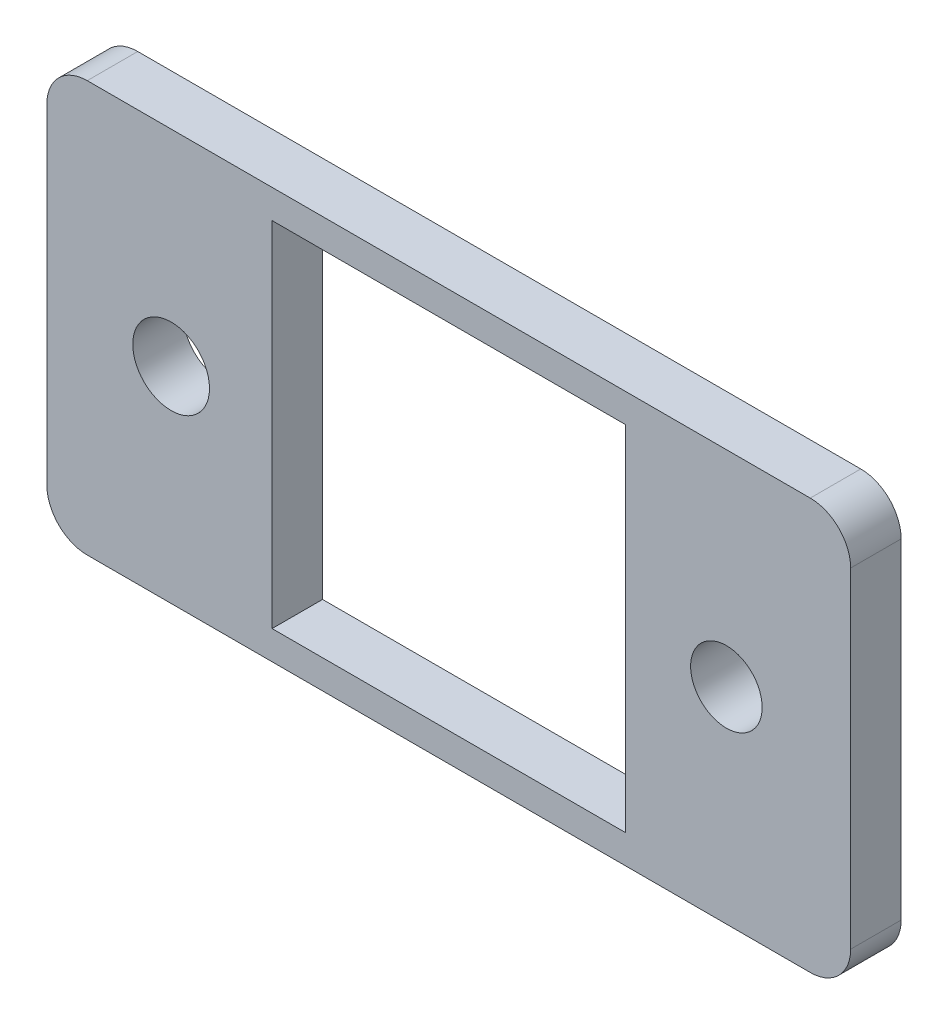
ISO-10303-21;
HEADER;
FILE_DESCRIPTION(('STEP AP214'),'2;1');
FILE_NAME('part.step','',(''),(''),'','','');
FILE_SCHEMA(('AUTOMOTIVE_DESIGN { 1 0 10303 214 1 1 1 1 }'));
ENDSEC;
DATA;
#1=APPLICATION_CONTEXT('core data for automotive mechanical design processes');
#2=APPLICATION_PROTOCOL_DEFINITION('international standard','automotive_design',2000,#1);
#3=PRODUCT_CONTEXT('',#1,'mechanical');
#4=PRODUCT('Part','Part','',(#3));
#5=PRODUCT_RELATED_PRODUCT_CATEGORY('part','',(#4));
#6=PRODUCT_DEFINITION_FORMATION('','',#4);
#7=PRODUCT_DEFINITION_CONTEXT('part definition',#1,'design');
#8=PRODUCT_DEFINITION('design','',#6,#7);
#9=PRODUCT_DEFINITION_SHAPE('','',#8);
#10=(LENGTH_UNIT() NAMED_UNIT(*) SI_UNIT(.MILLI.,.METRE.));
#11=(NAMED_UNIT(*) PLANE_ANGLE_UNIT() SI_UNIT($,.RADIAN.));
#12=(NAMED_UNIT(*) SI_UNIT($,.STERADIAN.) SOLID_ANGLE_UNIT());
#13=UNCERTAINTY_MEASURE_WITH_UNIT(LENGTH_MEASURE(1.E-05),#10,'distance_accuracy_value','');
#14=(GEOMETRIC_REPRESENTATION_CONTEXT(3) GLOBAL_UNCERTAINTY_ASSIGNED_CONTEXT((#13)) GLOBAL_UNIT_ASSIGNED_CONTEXT((#10,
#11,#12)) REPRESENTATION_CONTEXT('',''));
#15=CARTESIAN_POINT('',(0.,0.,0.));
#16=DIRECTION('',(0.,0.,1.));
#17=DIRECTION('',(1.,0.,0.));
#18=AXIS2_PLACEMENT_3D('',#15,#16,#17);
#19=CARTESIAN_POINT('',(0.,-12.9212908327685,3.175));
#20=DIRECTION('',(0.,1.,0.));
#21=DIRECTION('',(0.,0.,1.));
#22=AXIS2_PLACEMENT_3D('',#19,#20,#21);
#23=PLANE('',#22);
#24=DIRECTION('',(1.,0.,0.));
#25=VECTOR('',#24,1.);
#26=CARTESIAN_POINT('',(0.,-12.9212908327685,3.175));
#27=LINE('',#26,#25);
#28=CARTESIAN_POINT('',(-22.7378558296886,-12.9212908327685,3.175));
#29=VERTEX_POINT('',#28);
#30=CARTESIAN_POINT('',(22.737855829657,-12.9212908327685,3.175));
#31=VERTEX_POINT('',#30);
#32=EDGE_CURVE('E153',#29,#31,#27,.T.);
#33=ORIENTED_EDGE('',*,*,#32,.F.);
#34=DIRECTION('',(0.,0.,-1.));
#35=VECTOR('',#34,1.);
#36=CARTESIAN_POINT('',(-22.7378558296886,-12.9212908327685,0.));
#37=LINE('',#36,#35);
#38=CARTESIAN_POINT('',(-22.7378558296886,-12.9212908327685,0.));
#39=VERTEX_POINT('',#38);
#40=EDGE_CURVE('E198',#29,#39,#37,.T.);
#41=ORIENTED_EDGE('',*,*,#40,.T.);
#42=DIRECTION('',(1.,0.,0.));
#43=VECTOR('',#42,1.);
#44=CARTESIAN_POINT('',(0.,-12.9212908327685,0.));
#45=LINE('',#44,#43);
#46=CARTESIAN_POINT('',(22.737855829657,-12.9212908327685,0.));
#47=VERTEX_POINT('',#46);
#48=EDGE_CURVE('E179',#39,#47,#45,.T.);
#49=ORIENTED_EDGE('',*,*,#48,.T.);
#50=DIRECTION('',(0.,0.,-1.));
#51=VECTOR('',#50,1.);
#52=CARTESIAN_POINT('',(22.737855829657,-12.9212908327685,3.175));
#53=LINE('',#52,#51);
#54=EDGE_CURVE('E133',#47,#31,#53,.F.);
#55=ORIENTED_EDGE('',*,*,#54,.T.);
#56=EDGE_LOOP('',(#33,#41,#49,#55));
#57=FACE_BOUND('',#56,.T.);
#58=ADVANCED_FACE('F33',(#57),#23,.F.);
#59=CARTESIAN_POINT('',(25.277855829657,0.,3.175));
#60=DIRECTION('',(-1.,0.,0.));
#61=DIRECTION('',(0.,0.,1.));
#62=AXIS2_PLACEMENT_3D('',#59,#60,#61);
#63=PLANE('',#62);
#64=DIRECTION('',(0.,1.,0.));
#65=VECTOR('',#64,1.);
#66=CARTESIAN_POINT('',(25.277855829657,0.,3.175));
#67=LINE('',#66,#65);
#68=CARTESIAN_POINT('',(25.277855829657,-10.3812908327685,3.175));
#69=VERTEX_POINT('',#68);
#70=CARTESIAN_POINT('',(25.277855829657,10.3812908327721,3.175));
#71=VERTEX_POINT('',#70);
#72=EDGE_CURVE('E156',#69,#71,#67,.T.);
#73=ORIENTED_EDGE('',*,*,#72,.F.);
#74=DIRECTION('',(0.,0.,-1.));
#75=VECTOR('',#74,1.);
#76=CARTESIAN_POINT('',(25.277855829657,-10.3812908327685,3.175));
#77=LINE('',#76,#75);
#78=CARTESIAN_POINT('',(25.277855829657,-10.3812908327685,0.));
#79=VERTEX_POINT('',#78);
#80=EDGE_CURVE('E223',#69,#79,#77,.T.);
#81=ORIENTED_EDGE('',*,*,#80,.T.);
#82=DIRECTION('',(0.,1.,0.));
#83=VECTOR('',#82,1.);
#84=CARTESIAN_POINT('',(25.277855829657,0.,0.));
#85=LINE('',#84,#83);
#86=CARTESIAN_POINT('',(25.277855829657,10.3812908327721,0.));
#87=VERTEX_POINT('',#86);
#88=EDGE_CURVE('E182',#79,#87,#85,.T.);
#89=ORIENTED_EDGE('',*,*,#88,.T.);
#90=DIRECTION('',(0.,0.,-1.));
#91=VECTOR('',#90,1.);
#92=CARTESIAN_POINT('',(25.277855829657,10.3812908327721,3.175));
#93=LINE('',#92,#91);
#94=EDGE_CURVE('E221',#87,#71,#93,.F.);
#95=ORIENTED_EDGE('',*,*,#94,.T.);
#96=EDGE_LOOP('',(#73,#81,#89,#95));
#97=FACE_BOUND('',#96,.T.);
#98=ADVANCED_FACE('F229',(#97),#63,.F.);
#99=CARTESIAN_POINT('',(0.,12.9212908327721,3.175));
#100=DIRECTION('',(0.,1.,0.));
#101=DIRECTION('',(0.,0.,1.));
#102=AXIS2_PLACEMENT_3D('',#99,#100,#101);
#103=PLANE('',#102);
#104=DIRECTION('',(1.,0.,0.));
#105=VECTOR('',#104,1.);
#106=CARTESIAN_POINT('',(0.,12.9212908327721,3.175));
#107=LINE('',#106,#105);
#108=CARTESIAN_POINT('',(-22.7378558296886,12.9212908327721,3.175));
#109=VERTEX_POINT('',#108);
#110=CARTESIAN_POINT('',(22.737855829657,12.9212908327721,3.175));
#111=VERTEX_POINT('',#110);
#112=EDGE_CURVE('E158',#109,#111,#107,.T.);
#113=ORIENTED_EDGE('',*,*,#112,.T.);
#114=DIRECTION('',(0.,0.,-1.));
#115=VECTOR('',#114,1.);
#116=CARTESIAN_POINT('',(22.737855829657,12.9212908327721,0.));
#117=LINE('',#116,#115);
#118=CARTESIAN_POINT('',(22.737855829657,12.9212908327721,0.));
#119=VERTEX_POINT('',#118);
#120=EDGE_CURVE('E11',#111,#119,#117,.T.);
#121=ORIENTED_EDGE('',*,*,#120,.T.);
#122=DIRECTION('',(1.,0.,0.));
#123=VECTOR('',#122,1.);
#124=CARTESIAN_POINT('',(0.,12.9212908327721,0.));
#125=LINE('',#124,#123);
#126=CARTESIAN_POINT('',(-22.7378558296886,12.9212908327721,0.));
#127=VERTEX_POINT('',#126);
#128=EDGE_CURVE('E185',#127,#119,#125,.T.);
#129=ORIENTED_EDGE('',*,*,#128,.F.);
#130=DIRECTION('',(0.,0.,-1.));
#131=VECTOR('',#130,1.);
#132=CARTESIAN_POINT('',(-22.7378558296886,12.9212908327721,3.175));
#133=LINE('',#132,#131);
#134=EDGE_CURVE('E41',#127,#109,#133,.F.);
#135=ORIENTED_EDGE('',*,*,#134,.T.);
#136=EDGE_LOOP('',(#113,#121,#129,#135));
#137=FACE_BOUND('',#136,.T.);
#138=ADVANCED_FACE('F239',(#137),#103,.T.);
#139=CARTESIAN_POINT('',(11.1124999999842,0.,3.175));
#140=DIRECTION('',(-1.,0.,0.));
#141=DIRECTION('',(0.,0.,1.));
#142=AXIS2_PLACEMENT_3D('',#139,#140,#141);
#143=PLANE('',#142);
#144=DIRECTION('',(0.,1.,0.));
#145=VECTOR('',#144,1.);
#146=CARTESIAN_POINT('',(11.1124999999842,0.,0.));
#147=LINE('',#146,#145);
#148=CARTESIAN_POINT('',(11.1124999999842,-11.1124999999982,0.));
#149=VERTEX_POINT('',#148);
#150=CARTESIAN_POINT('',(11.1124999999842,11.1125000000018,0.));
#151=VERTEX_POINT('',#150);
#152=EDGE_CURVE('E128',#149,#151,#147,.T.);
#153=ORIENTED_EDGE('',*,*,#152,.F.);
#154=DIRECTION('',(0.,0.,-1.));
#155=VECTOR('',#154,1.);
#156=CARTESIAN_POINT('',(11.1124999999842,-11.1124999999982,3.175));
#157=LINE('',#156,#155);
#158=CARTESIAN_POINT('',(11.1124999999842,-11.1124999999982,3.175));
#159=VERTEX_POINT('',#158);
#160=EDGE_CURVE('E123',#159,#149,#157,.T.);
#161=ORIENTED_EDGE('',*,*,#160,.F.);
#162=DIRECTION('',(0.,1.,0.));
#163=VECTOR('',#162,1.);
#164=CARTESIAN_POINT('',(11.1124999999842,0.,3.175));
#165=LINE('',#164,#163);
#166=CARTESIAN_POINT('',(11.1124999999842,11.1125000000018,3.175));
#167=VERTEX_POINT('',#166);
#168=EDGE_CURVE('E126',#159,#167,#165,.T.);
#169=ORIENTED_EDGE('',*,*,#168,.T.);
#170=DIRECTION('',(0.,0.,-1.));
#171=VECTOR('',#170,1.);
#172=CARTESIAN_POINT('',(11.1124999999842,11.1125000000018,3.175));
#173=LINE('',#172,#171);
#174=EDGE_CURVE('E163',#167,#151,#173,.T.);
#175=ORIENTED_EDGE('',*,*,#174,.T.);
#176=EDGE_LOOP('',(#153,#161,#169,#175));
#177=FACE_BOUND('',#176,.T.);
#178=ADVANCED_FACE('F125',(#177),#143,.T.);
#179=CARTESIAN_POINT('',(0.,-11.1124999999982,3.175));
#180=DIRECTION('',(0.,1.,0.));
#181=DIRECTION('',(-1.,0.,0.));
#182=AXIS2_PLACEMENT_3D('',#179,#180,#181);
#183=PLANE('',#182);
#184=DIRECTION('',(1.,0.,0.));
#185=VECTOR('',#184,1.);
#186=CARTESIAN_POINT('',(0.,-11.1124999999982,0.));
#187=LINE('',#186,#185);
#188=CARTESIAN_POINT('',(-11.1125000000158,-11.1124999999982,0.));
#189=VERTEX_POINT('',#188);
#190=EDGE_CURVE('E171',#189,#149,#187,.T.);
#191=ORIENTED_EDGE('',*,*,#190,.F.);
#192=DIRECTION('',(0.,0.,-1.));
#193=VECTOR('',#192,1.);
#194=CARTESIAN_POINT('',(-11.1125000000158,-11.1124999999982,3.175));
#195=LINE('',#194,#193);
#196=CARTESIAN_POINT('',(-11.1125000000158,-11.1124999999982,3.175));
#197=VERTEX_POINT('',#196);
#198=EDGE_CURVE('E134',#197,#189,#195,.T.);
#199=ORIENTED_EDGE('',*,*,#198,.F.);
#200=DIRECTION('',(1.,0.,0.));
#201=VECTOR('',#200,1.);
#202=CARTESIAN_POINT('',(0.,-11.1124999999982,3.175));
#203=LINE('',#202,#201);
#204=EDGE_CURVE('E140',#197,#159,#203,.T.);
#205=ORIENTED_EDGE('',*,*,#204,.T.);
#206=ORIENTED_EDGE('',*,*,#160,.T.);
#207=EDGE_LOOP('',(#191,#199,#205,#206));
#208=FACE_BOUND('',#207,.T.);
#209=ADVANCED_FACE('F145',(#208),#183,.T.);
#210=CARTESIAN_POINT('',(-11.1125000000158,0.,3.175));
#211=DIRECTION('',(-1.,0.,0.));
#212=DIRECTION('',(0.,0.,1.));
#213=AXIS2_PLACEMENT_3D('',#210,#211,#212);
#214=PLANE('',#213);
#215=DIRECTION('',(0.,1.,0.));
#216=VECTOR('',#215,1.);
#217=CARTESIAN_POINT('',(-11.1125000000158,0.,0.));
#218=LINE('',#217,#216);
#219=CARTESIAN_POINT('',(-11.1125000000158,11.1125000000018,0.));
#220=VERTEX_POINT('',#219);
#221=EDGE_CURVE('E173',#189,#220,#218,.T.);
#222=ORIENTED_EDGE('',*,*,#221,.T.);
#223=DIRECTION('',(0.,0.,-1.));
#224=VECTOR('',#223,1.);
#225=CARTESIAN_POINT('',(-11.1125000000158,11.1125000000018,3.175));
#226=LINE('',#225,#224);
#227=CARTESIAN_POINT('',(-11.1125000000158,11.1125000000018,3.175));
#228=VERTEX_POINT('',#227);
#229=EDGE_CURVE('E193',#228,#220,#226,.T.);
#230=ORIENTED_EDGE('',*,*,#229,.F.);
#231=DIRECTION('',(0.,1.,0.));
#232=VECTOR('',#231,1.);
#233=CARTESIAN_POINT('',(-11.1125000000158,0.,3.175));
#234=LINE('',#233,#232);
#235=EDGE_CURVE('E147',#197,#228,#234,.T.);
#236=ORIENTED_EDGE('',*,*,#235,.F.);
#237=ORIENTED_EDGE('',*,*,#198,.T.);
#238=EDGE_LOOP('',(#222,#230,#236,#237));
#239=FACE_BOUND('',#238,.T.);
#240=ADVANCED_FACE('F275',(#239),#214,.F.);
#241=CARTESIAN_POINT('',(0.,11.1125000000018,3.175));
#242=DIRECTION('',(0.,1.,0.));
#243=DIRECTION('',(-1.,0.,0.));
#244=AXIS2_PLACEMENT_3D('',#241,#242,#243);
#245=PLANE('',#244);
#246=DIRECTION('',(1.,0.,0.));
#247=VECTOR('',#246,1.);
#248=CARTESIAN_POINT('',(0.,11.1125000000018,0.));
#249=LINE('',#248,#247);
#250=EDGE_CURVE('E176',#220,#151,#249,.T.);
#251=ORIENTED_EDGE('',*,*,#250,.T.);
#252=ORIENTED_EDGE('',*,*,#174,.F.);
#253=DIRECTION('',(1.,0.,0.));
#254=VECTOR('',#253,1.);
#255=CARTESIAN_POINT('',(0.,11.1125000000018,3.175));
#256=LINE('',#255,#254);
#257=EDGE_CURVE('E141',#228,#167,#256,.T.);
#258=ORIENTED_EDGE('',*,*,#257,.F.);
#259=ORIENTED_EDGE('',*,*,#229,.T.);
#260=EDGE_LOOP('',(#251,#252,#258,#259));
#261=FACE_BOUND('',#260,.T.);
#262=ADVANCED_FACE('F271',(#261),#245,.F.);
#263=CARTESIAN_POINT('',(-17.4625000000424,9.16203774564736E-11,3.175));
#264=DIRECTION('',(0.,0.,-1.));
#265=DIRECTION('',(-1.,0.,0.));
#266=AXIS2_PLACEMENT_3D('',#263,#264,#265);
#267=CYLINDRICAL_SURFACE('',#266,2.413);
#268=CARTESIAN_POINT('',(-17.4625000000424,9.16203774564736E-11,3.175));
#269=DIRECTION('',(0.,0.,1.));
#270=DIRECTION('',(1.,0.,0.));
#271=AXIS2_PLACEMENT_3D('',#268,#269,#270);
#272=CIRCLE('',#271,2.413);
#273=CARTESIAN_POINT('',(-15.0495000000424,9.16203774564736E-11,3.175));
#274=VERTEX_POINT('',#273);
#275=EDGE_CURVE('E143',#274,#274,#272,.T.);
#276=ORIENTED_EDGE('',*,*,#275,.T.);
#277=EDGE_LOOP('',(#276));
#278=FACE_BOUND('',#277,.T.);
#279=CARTESIAN_POINT('',(-17.4625000000424,9.16203774564736E-11,0.));
#280=DIRECTION('',(0.,0.,1.));
#281=DIRECTION('',(1.,0.,0.));
#282=AXIS2_PLACEMENT_3D('',#279,#280,#281);
#283=CIRCLE('',#282,2.413);
#284=CARTESIAN_POINT('',(-15.0495000000424,9.16203774564736E-11,0.));
#285=VERTEX_POINT('',#284);
#286=EDGE_CURVE('E167',#285,#285,#283,.T.);
#287=ORIENTED_EDGE('',*,*,#286,.F.);
#288=EDGE_LOOP('',(#287));
#289=FACE_BOUND('',#288,.T.);
#290=ADVANCED_FACE('F274',(#278,#289),#267,.F.);
#291=CARTESIAN_POINT('',(17.4624999999576,9.1621155107191E-11,3.175));
#292=DIRECTION('',(0.,0.,-1.));
#293=DIRECTION('',(-1.,0.,0.));
#294=AXIS2_PLACEMENT_3D('',#291,#292,#293);
#295=CYLINDRICAL_SURFACE('',#294,2.24976662870495);
#296=CARTESIAN_POINT('',(17.4624999999576,9.1621155107191E-11,3.175));
#297=DIRECTION('',(0.,0.,1.));
#298=DIRECTION('',(1.,0.,0.));
#299=AXIS2_PLACEMENT_3D('',#296,#297,#298);
#300=CIRCLE('',#299,2.24976662870495);
#301=CARTESIAN_POINT('',(19.7122666286626,9.1621155107191E-11,3.175));
#302=VERTEX_POINT('',#301);
#303=EDGE_CURVE('E191',#302,#302,#300,.T.);
#304=ORIENTED_EDGE('',*,*,#303,.T.);
#305=EDGE_LOOP('',(#304));
#306=FACE_BOUND('',#305,.T.);
#307=CARTESIAN_POINT('',(17.4624999999576,9.1621155107191E-11,0.));
#308=DIRECTION('',(0.,0.,1.));
#309=DIRECTION('',(1.,0.,0.));
#310=AXIS2_PLACEMENT_3D('',#307,#308,#309);
#311=CIRCLE('',#310,2.24976662870495);
#312=CARTESIAN_POINT('',(19.7122666286626,9.1621155107191E-11,0.));
#313=VERTEX_POINT('',#312);
#314=EDGE_CURVE('E164',#313,#313,#311,.T.);
#315=ORIENTED_EDGE('',*,*,#314,.F.);
#316=EDGE_LOOP('',(#315));
#317=FACE_BOUND('',#316,.T.);
#318=ADVANCED_FACE('F286',(#306,#317),#295,.F.);
#319=CARTESIAN_POINT('',(-25.2778558296886,0.,3.175));
#320=DIRECTION('',(-1.,0.,0.));
#321=DIRECTION('',(0.,0.,1.));
#322=AXIS2_PLACEMENT_3D('',#319,#320,#321);
#323=PLANE('',#322);
#324=DIRECTION('',(0.,1.,0.));
#325=VECTOR('',#324,1.);
#326=CARTESIAN_POINT('',(-25.2778558296886,0.,0.));
#327=LINE('',#326,#325);
#328=CARTESIAN_POINT('',(-25.2778558296886,-10.3812908327685,0.));
#329=VERTEX_POINT('',#328);
#330=CARTESIAN_POINT('',(-25.2778558296886,10.3812908327721,0.));
#331=VERTEX_POINT('',#330);
#332=EDGE_CURVE('E188',#329,#331,#327,.T.);
#333=ORIENTED_EDGE('',*,*,#332,.F.);
#334=DIRECTION('',(0.,0.,-1.));
#335=VECTOR('',#334,1.);
#336=CARTESIAN_POINT('',(-25.2778558296886,-10.3812908327685,3.175));
#337=LINE('',#336,#335);
#338=CARTESIAN_POINT('',(-25.2778558296886,-10.3812908327685,3.175));
#339=VERTEX_POINT('',#338);
#340=EDGE_CURVE('E212',#329,#339,#337,.F.);
#341=ORIENTED_EDGE('',*,*,#340,.T.);
#342=DIRECTION('',(0.,1.,0.));
#343=VECTOR('',#342,1.);
#344=CARTESIAN_POINT('',(-25.2778558296886,0.,3.175));
#345=LINE('',#344,#343);
#346=CARTESIAN_POINT('',(-25.2778558296886,10.3812908327721,3.175));
#347=VERTEX_POINT('',#346);
#348=EDGE_CURVE('E160',#339,#347,#345,.T.);
#349=ORIENTED_EDGE('',*,*,#348,.T.);
#350=DIRECTION('',(0.,0.,-1.));
#351=VECTOR('',#350,1.);
#352=CARTESIAN_POINT('',(-25.2778558296886,10.3812908327721,3.175));
#353=LINE('',#352,#351);
#354=EDGE_CURVE('E209',#347,#331,#353,.T.);
#355=ORIENTED_EDGE('',*,*,#354,.T.);
#356=EDGE_LOOP('',(#333,#341,#349,#355));
#357=FACE_BOUND('',#356,.T.);
#358=ADVANCED_FACE('F246',(#357),#323,.T.);
#359=CARTESIAN_POINT('',(0.,0.,3.175));
#360=DIRECTION('',(0.,0.,1.));
#361=DIRECTION('',(1.,0.,0.));
#362=AXIS2_PLACEMENT_3D('',#359,#360,#361);
#363=PLANE('',#362);
#364=ORIENTED_EDGE('',*,*,#303,.F.);
#365=EDGE_LOOP('',(#364));
#366=FACE_BOUND('',#365,.T.);
#367=ORIENTED_EDGE('',*,*,#275,.F.);
#368=EDGE_LOOP('',(#367));
#369=FACE_BOUND('',#368,.T.);
#370=ORIENTED_EDGE('',*,*,#168,.F.);
#371=ORIENTED_EDGE('',*,*,#204,.F.);
#372=ORIENTED_EDGE('',*,*,#235,.T.);
#373=ORIENTED_EDGE('',*,*,#257,.T.);
#374=EDGE_LOOP('',(#370,#371,#372,#373));
#375=FACE_BOUND('',#374,.T.);
#376=ORIENTED_EDGE('',*,*,#348,.F.);
#377=CARTESIAN_POINT('',(-22.7378558296886,-10.3812908327685,3.175));
#378=DIRECTION('',(0.,0.,1.));
#379=DIRECTION('',(1.,0.,0.));
#380=AXIS2_PLACEMENT_3D('',#377,#378,#379);
#381=CIRCLE('',#380,2.54);
#382=EDGE_CURVE('E219',#339,#29,#381,.T.);
#383=ORIENTED_EDGE('',*,*,#382,.T.);
#384=ORIENTED_EDGE('',*,*,#32,.T.);
#385=CARTESIAN_POINT('',(22.737855829657,-10.3812908327685,3.175));
#386=DIRECTION('',(0.,0.,1.));
#387=DIRECTION('',(1.,0.,0.));
#388=AXIS2_PLACEMENT_3D('',#385,#386,#387);
#389=CIRCLE('',#388,2.54);
#390=EDGE_CURVE('E217',#31,#69,#389,.T.);
#391=ORIENTED_EDGE('',*,*,#390,.T.);
#392=ORIENTED_EDGE('',*,*,#72,.T.);
#393=CARTESIAN_POINT('',(22.737855829657,10.3812908327721,3.175));
#394=DIRECTION('',(0.,0.,1.));
#395=DIRECTION('',(1.,0.,0.));
#396=AXIS2_PLACEMENT_3D('',#393,#394,#395);
#397=CIRCLE('',#396,2.54);
#398=EDGE_CURVE('E48',#71,#111,#397,.T.);
#399=ORIENTED_EDGE('',*,*,#398,.T.);
#400=ORIENTED_EDGE('',*,*,#112,.F.);
#401=CARTESIAN_POINT('',(-22.7378558296886,10.3812908327721,3.175));
#402=DIRECTION('',(0.,0.,1.));
#403=DIRECTION('',(1.,0.,0.));
#404=AXIS2_PLACEMENT_3D('',#401,#402,#403);
#405=CIRCLE('',#404,2.54);
#406=EDGE_CURVE('E214',#109,#347,#405,.T.);
#407=ORIENTED_EDGE('',*,*,#406,.T.);
#408=EDGE_LOOP('',(#376,#383,#384,#391,#392,#399,#400,#407));
#409=FACE_BOUND('',#408,.T.);
#410=ADVANCED_FACE('F138',(#366,#369,#375,#409),#363,.T.);
#411=CARTESIAN_POINT('',(0.,0.,0.));
#412=DIRECTION('',(0.,0.,1.));
#413=DIRECTION('',(1.,0.,0.));
#414=AXIS2_PLACEMENT_3D('',#411,#412,#413);
#415=PLANE('',#414);
#416=ORIENTED_EDGE('',*,*,#314,.T.);
#417=EDGE_LOOP('',(#416));
#418=FACE_BOUND('',#417,.T.);
#419=ORIENTED_EDGE('',*,*,#286,.T.);
#420=EDGE_LOOP('',(#419));
#421=FACE_BOUND('',#420,.T.);
#422=ORIENTED_EDGE('',*,*,#152,.T.);
#423=ORIENTED_EDGE('',*,*,#250,.F.);
#424=ORIENTED_EDGE('',*,*,#221,.F.);
#425=ORIENTED_EDGE('',*,*,#190,.T.);
#426=EDGE_LOOP('',(#422,#423,#424,#425));
#427=FACE_BOUND('',#426,.T.);
#428=ORIENTED_EDGE('',*,*,#48,.F.);
#429=CARTESIAN_POINT('',(-22.7378558296886,-10.3812908327685,0.));
#430=DIRECTION('',(0.,0.,1.));
#431=DIRECTION('',(1.,0.,0.));
#432=AXIS2_PLACEMENT_3D('',#429,#430,#431);
#433=CIRCLE('',#432,2.54);
#434=EDGE_CURVE('E207',#39,#329,#433,.F.);
#435=ORIENTED_EDGE('',*,*,#434,.T.);
#436=ORIENTED_EDGE('',*,*,#332,.T.);
#437=CARTESIAN_POINT('',(-22.7378558296886,10.3812908327721,0.));
#438=DIRECTION('',(0.,0.,1.));
#439=DIRECTION('',(1.,0.,0.));
#440=AXIS2_PLACEMENT_3D('',#437,#438,#439);
#441=CIRCLE('',#440,2.54);
#442=EDGE_CURVE('E201',#331,#127,#441,.F.);
#443=ORIENTED_EDGE('',*,*,#442,.T.);
#444=ORIENTED_EDGE('',*,*,#128,.T.);
#445=CARTESIAN_POINT('',(22.737855829657,10.3812908327721,0.));
#446=DIRECTION('',(0.,0.,1.));
#447=DIRECTION('',(1.,0.,0.));
#448=AXIS2_PLACEMENT_3D('',#445,#446,#447);
#449=CIRCLE('',#448,2.54);
#450=EDGE_CURVE('E203',#119,#87,#449,.F.);
#451=ORIENTED_EDGE('',*,*,#450,.T.);
#452=ORIENTED_EDGE('',*,*,#88,.F.);
#453=CARTESIAN_POINT('',(22.737855829657,-10.3812908327685,0.));
#454=DIRECTION('',(0.,0.,1.));
#455=DIRECTION('',(1.,0.,0.));
#456=AXIS2_PLACEMENT_3D('',#453,#454,#455);
#457=CIRCLE('',#456,2.54);
#458=EDGE_CURVE('E205',#79,#47,#457,.F.);
#459=ORIENTED_EDGE('',*,*,#458,.T.);
#460=EDGE_LOOP('',(#428,#435,#436,#443,#444,#451,#452,#459));
#461=FACE_BOUND('',#460,.T.);
#462=ADVANCED_FACE('F235',(#418,#421,#427,#461),#415,.F.);
#463=CARTESIAN_POINT('',(-22.7378558296886,-10.3812908327685,3.175));
#464=DIRECTION('',(0.,0.,1.));
#465=DIRECTION('',(1.,0.,0.));
#466=AXIS2_PLACEMENT_3D('',#463,#464,#465);
#467=CYLINDRICAL_SURFACE('',#466,2.54);
#468=ORIENTED_EDGE('',*,*,#382,.F.);
#469=ORIENTED_EDGE('',*,*,#340,.F.);
#470=ORIENTED_EDGE('',*,*,#434,.F.);
#471=ORIENTED_EDGE('',*,*,#40,.F.);
#472=EDGE_LOOP('',(#468,#469,#470,#471));
#473=FACE_BOUND('',#472,.T.);
#474=ADVANCED_FACE('F251',(#473),#467,.T.);
#475=CARTESIAN_POINT('',(22.737855829657,-10.3812908327685,3.175));
#476=DIRECTION('',(0.,0.,-1.));
#477=DIRECTION('',(-1.,0.,0.));
#478=AXIS2_PLACEMENT_3D('',#475,#476,#477);
#479=CYLINDRICAL_SURFACE('',#478,2.54);
#480=ORIENTED_EDGE('',*,*,#390,.F.);
#481=ORIENTED_EDGE('',*,*,#54,.F.);
#482=ORIENTED_EDGE('',*,*,#458,.F.);
#483=ORIENTED_EDGE('',*,*,#80,.F.);
#484=EDGE_LOOP('',(#480,#481,#482,#483));
#485=FACE_BOUND('',#484,.T.);
#486=ADVANCED_FACE('F255',(#485),#479,.T.);
#487=CARTESIAN_POINT('',(22.737855829657,10.3812908327721,3.175));
#488=DIRECTION('',(0.,0.,1.));
#489=DIRECTION('',(1.,0.,0.));
#490=AXIS2_PLACEMENT_3D('',#487,#488,#489);
#491=CYLINDRICAL_SURFACE('',#490,2.54);
#492=ORIENTED_EDGE('',*,*,#398,.F.);
#493=ORIENTED_EDGE('',*,*,#94,.F.);
#494=ORIENTED_EDGE('',*,*,#450,.F.);
#495=ORIENTED_EDGE('',*,*,#120,.F.);
#496=EDGE_LOOP('',(#492,#493,#494,#495));
#497=FACE_BOUND('',#496,.T.);
#498=ADVANCED_FACE('F238',(#497),#491,.T.);
#499=CARTESIAN_POINT('',(-22.7378558296886,10.3812908327721,3.175));
#500=DIRECTION('',(0.,0.,-1.));
#501=DIRECTION('',(-1.,0.,0.));
#502=AXIS2_PLACEMENT_3D('',#499,#500,#501);
#503=CYLINDRICAL_SURFACE('',#502,2.54);
#504=ORIENTED_EDGE('',*,*,#406,.F.);
#505=ORIENTED_EDGE('',*,*,#134,.F.);
#506=ORIENTED_EDGE('',*,*,#442,.F.);
#507=ORIENTED_EDGE('',*,*,#354,.F.);
#508=EDGE_LOOP('',(#504,#505,#506,#507));
#509=FACE_BOUND('',#508,.T.);
#510=ADVANCED_FACE('F35',(#509),#503,.T.);
#511=CLOSED_SHELL('',(#58,#98,#138,#178,#209,#240,#262,#290,#318,#358,#410,#462,#474,#486,#498,#510));
#512=MANIFOLD_SOLID_BREP('B2',#511);
#513=ADVANCED_BREP_SHAPE_REPRESENTATION('',(#18,#512),#14);
#514=SHAPE_DEFINITION_REPRESENTATION(#9,#513);
ENDSEC;
END-ISO-10303-21;
